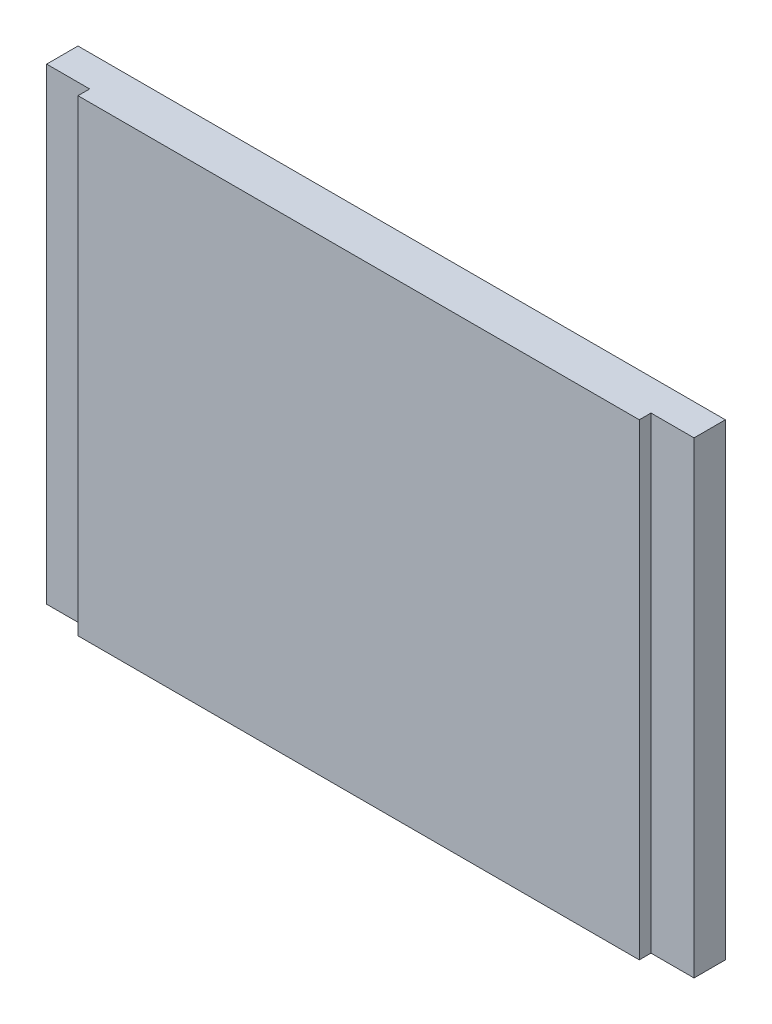
ISO-10303-21;
HEADER;
FILE_DESCRIPTION(('STEP AP214'),'2;1');
FILE_NAME('part.step','',(''),(''),'','','');
FILE_SCHEMA(('AUTOMOTIVE_DESIGN { 1 0 10303 214 1 1 1 1 }'));
ENDSEC;
DATA;
#1=APPLICATION_CONTEXT('core data for automotive mechanical design processes');
#2=APPLICATION_PROTOCOL_DEFINITION('international standard','automotive_design',2000,#1);
#3=PRODUCT_CONTEXT('',#1,'mechanical');
#4=PRODUCT('Part','Part','',(#3));
#5=PRODUCT_RELATED_PRODUCT_CATEGORY('part','',(#4));
#6=PRODUCT_DEFINITION_FORMATION('','',#4);
#7=PRODUCT_DEFINITION_CONTEXT('part definition',#1,'design');
#8=PRODUCT_DEFINITION('design','',#6,#7);
#9=PRODUCT_DEFINITION_SHAPE('','',#8);
#10=(LENGTH_UNIT() NAMED_UNIT(*) SI_UNIT(.MILLI.,.METRE.));
#11=(NAMED_UNIT(*) PLANE_ANGLE_UNIT() SI_UNIT($,.RADIAN.));
#12=(NAMED_UNIT(*) SI_UNIT($,.STERADIAN.) SOLID_ANGLE_UNIT());
#13=UNCERTAINTY_MEASURE_WITH_UNIT(LENGTH_MEASURE(1.E-05),#10,'distance_accuracy_value','');
#14=(GEOMETRIC_REPRESENTATION_CONTEXT(3) GLOBAL_UNCERTAINTY_ASSIGNED_CONTEXT((#13)) GLOBAL_UNIT_ASSIGNED_CONTEXT((#10,
#11,#12)) REPRESENTATION_CONTEXT('',''));
#15=CARTESIAN_POINT('',(0.,0.,0.));
#16=DIRECTION('',(0.,0.,1.));
#17=DIRECTION('',(1.,0.,0.));
#18=AXIS2_PLACEMENT_3D('',#15,#16,#17);
#19=CARTESIAN_POINT('',(0.,0.,5.842));
#20=DIRECTION('',(1.,0.,0.));
#21=DIRECTION('',(0.,0.,-1.));
#22=AXIS2_PLACEMENT_3D('',#19,#20,#21);
#23=PLANE('',#22);
#24=DIRECTION('',(0.,0.,-1.));
#25=VECTOR('',#24,1.);
#26=CARTESIAN_POINT('',(0.,0.,5.842));
#27=LINE('',#26,#25);
#28=CARTESIAN_POINT('',(0.,0.,4.2545));
#29=VERTEX_POINT('',#28);
#30=CARTESIAN_POINT('',(0.,0.,0.));
#31=VERTEX_POINT('',#30);
#32=EDGE_CURVE('E11',#29,#31,#27,.T.);
#33=ORIENTED_EDGE('',*,*,#32,.F.);
#34=DIRECTION('',(0.,-1.,0.));
#35=VECTOR('',#34,1.);
#36=CARTESIAN_POINT('',(0.,0.,4.2545));
#37=LINE('',#36,#35);
#38=CARTESIAN_POINT('',(0.,63.5,4.2545));
#39=VERTEX_POINT('',#38);
#40=EDGE_CURVE('E150',#39,#29,#37,.T.);
#41=ORIENTED_EDGE('',*,*,#40,.F.);
#42=DIRECTION('',(0.,0.,-1.));
#43=VECTOR('',#42,1.);
#44=CARTESIAN_POINT('',(0.,63.5,5.842));
#45=LINE('',#44,#43);
#46=CARTESIAN_POINT('',(0.,63.5,0.));
#47=VERTEX_POINT('',#46);
#48=EDGE_CURVE('E125',#39,#47,#45,.T.);
#49=ORIENTED_EDGE('',*,*,#48,.T.);
#50=DIRECTION('',(0.,-1.,0.));
#51=VECTOR('',#50,1.);
#52=CARTESIAN_POINT('',(0.,0.,0.));
#53=LINE('',#52,#51);
#54=EDGE_CURVE('E137',#47,#31,#53,.T.);
#55=ORIENTED_EDGE('',*,*,#54,.T.);
#56=EDGE_LOOP('',(#33,#41,#49,#55));
#57=FACE_BOUND('',#56,.T.);
#58=ADVANCED_FACE('F37',(#57),#23,.F.);
#59=CARTESIAN_POINT('',(0.,0.,5.842));
#60=DIRECTION('',(0.,1.,0.));
#61=DIRECTION('',(0.,0.,1.));
#62=AXIS2_PLACEMENT_3D('',#59,#60,#61);
#63=PLANE('',#62);
#64=DIRECTION('',(1.,0.,0.));
#65=VECTOR('',#64,1.);
#66=CARTESIAN_POINT('',(87.884,0.,4.2545));
#67=LINE('',#66,#65);
#68=CARTESIAN_POINT('',(82.042,0.,4.2545));
#69=VERTEX_POINT('',#68);
#70=CARTESIAN_POINT('',(87.884,0.,4.2545));
#71=VERTEX_POINT('',#70);
#72=EDGE_CURVE('E107',#69,#71,#67,.T.);
#73=ORIENTED_EDGE('',*,*,#72,.F.);
#74=DIRECTION('',(0.,0.,1.));
#75=VECTOR('',#74,1.);
#76=CARTESIAN_POINT('',(82.042,0.,4.2545));
#77=LINE('',#76,#75);
#78=CARTESIAN_POINT('',(82.042,0.,5.842));
#79=VERTEX_POINT('',#78);
#80=EDGE_CURVE('E151',#69,#79,#77,.T.);
#81=ORIENTED_EDGE('',*,*,#80,.T.);
#82=DIRECTION('',(1.,0.,0.));
#83=VECTOR('',#82,1.);
#84=CARTESIAN_POINT('',(0.,0.,5.842));
#85=LINE('',#84,#83);
#86=CARTESIAN_POINT('',(5.84199999999999,0.,5.842));
#87=VERTEX_POINT('',#86);
#88=EDGE_CURVE('E132',#87,#79,#85,.T.);
#89=ORIENTED_EDGE('',*,*,#88,.F.);
#90=DIRECTION('',(0.,0.,1.));
#91=VECTOR('',#90,1.);
#92=CARTESIAN_POINT('',(5.84199999999999,0.,4.2545));
#93=LINE('',#92,#91);
#94=CARTESIAN_POINT('',(5.84199999999999,0.,4.2545));
#95=VERTEX_POINT('',#94);
#96=EDGE_CURVE('E59',#95,#87,#93,.T.);
#97=ORIENTED_EDGE('',*,*,#96,.F.);
#98=DIRECTION('',(1.,0.,0.));
#99=VECTOR('',#98,1.);
#100=CARTESIAN_POINT('',(0.,0.,4.2545));
#101=LINE('',#100,#99);
#102=EDGE_CURVE('E156',#29,#95,#101,.T.);
#103=ORIENTED_EDGE('',*,*,#102,.F.);
#104=ORIENTED_EDGE('',*,*,#32,.T.);
#105=DIRECTION('',(1.,0.,0.));
#106=VECTOR('',#105,1.);
#107=CARTESIAN_POINT('',(0.,0.,0.));
#108=LINE('',#107,#106);
#109=CARTESIAN_POINT('',(87.884,0.,0.));
#110=VERTEX_POINT('',#109);
#111=EDGE_CURVE('E134',#31,#110,#108,.T.);
#112=ORIENTED_EDGE('',*,*,#111,.T.);
#113=DIRECTION('',(0.,0.,-1.));
#114=VECTOR('',#113,1.);
#115=CARTESIAN_POINT('',(87.884,0.,5.842));
#116=LINE('',#115,#114);
#117=EDGE_CURVE('E44',#71,#110,#116,.T.);
#118=ORIENTED_EDGE('',*,*,#117,.F.);
#119=EDGE_LOOP('',(#73,#81,#89,#97,#103,#104,#112,#118));
#120=FACE_BOUND('',#119,.T.);
#121=ADVANCED_FACE('F166',(#120),#63,.F.);
#122=CARTESIAN_POINT('',(87.884,0.,5.842));
#123=DIRECTION('',(-1.,0.,0.));
#124=DIRECTION('',(0.,0.,1.));
#125=AXIS2_PLACEMENT_3D('',#122,#123,#124);
#126=PLANE('',#125);
#127=DIRECTION('',(0.,0.,-1.));
#128=VECTOR('',#127,1.);
#129=CARTESIAN_POINT('',(87.884,63.5,5.842));
#130=LINE('',#129,#128);
#131=CARTESIAN_POINT('',(87.884,63.5,4.2545));
#132=VERTEX_POINT('',#131);
#133=CARTESIAN_POINT('',(87.884,63.5,0.));
#134=VERTEX_POINT('',#133);
#135=EDGE_CURVE('E117',#132,#134,#130,.T.);
#136=ORIENTED_EDGE('',*,*,#135,.F.);
#137=DIRECTION('',(0.,1.,0.));
#138=VECTOR('',#137,1.);
#139=CARTESIAN_POINT('',(87.884,63.5,4.2545));
#140=LINE('',#139,#138);
#141=EDGE_CURVE('E101',#71,#132,#140,.T.);
#142=ORIENTED_EDGE('',*,*,#141,.F.);
#143=ORIENTED_EDGE('',*,*,#117,.T.);
#144=DIRECTION('',(0.,1.,0.));
#145=VECTOR('',#144,1.);
#146=CARTESIAN_POINT('',(87.884,0.,0.));
#147=LINE('',#146,#145);
#148=EDGE_CURVE('E123',#110,#134,#147,.T.);
#149=ORIENTED_EDGE('',*,*,#148,.T.);
#150=EDGE_LOOP('',(#136,#142,#143,#149));
#151=FACE_BOUND('',#150,.T.);
#152=ADVANCED_FACE('F121',(#151),#126,.F.);
#153=CARTESIAN_POINT('',(0.,63.5,5.842));
#154=DIRECTION('',(0.,-1.,0.));
#155=DIRECTION('',(0.,0.,-1.));
#156=AXIS2_PLACEMENT_3D('',#153,#154,#155);
#157=PLANE('',#156);
#158=DIRECTION('',(-1.,0.,0.));
#159=VECTOR('',#158,1.);
#160=CARTESIAN_POINT('',(0.,63.5,5.842));
#161=LINE('',#160,#159);
#162=CARTESIAN_POINT('',(82.042,63.5,5.842));
#163=VERTEX_POINT('',#162);
#164=CARTESIAN_POINT('',(5.84199999999999,63.5,5.842));
#165=VERTEX_POINT('',#164);
#166=EDGE_CURVE('E127',#163,#165,#161,.T.);
#167=ORIENTED_EDGE('',*,*,#166,.F.);
#168=DIRECTION('',(0.,0.,1.));
#169=VECTOR('',#168,1.);
#170=CARTESIAN_POINT('',(82.042,63.5,4.2545));
#171=LINE('',#170,#169);
#172=CARTESIAN_POINT('',(82.042,63.5,4.2545));
#173=VERTEX_POINT('',#172);
#174=EDGE_CURVE('E51',#173,#163,#171,.T.);
#175=ORIENTED_EDGE('',*,*,#174,.F.);
#176=DIRECTION('',(-1.,0.,0.));
#177=VECTOR('',#176,1.);
#178=CARTESIAN_POINT('',(87.884,63.5,4.2545));
#179=LINE('',#178,#177);
#180=EDGE_CURVE('E105',#132,#173,#179,.T.);
#181=ORIENTED_EDGE('',*,*,#180,.F.);
#182=ORIENTED_EDGE('',*,*,#135,.T.);
#183=DIRECTION('',(-1.,0.,0.));
#184=VECTOR('',#183,1.);
#185=CARTESIAN_POINT('',(0.,63.5,0.));
#186=LINE('',#185,#184);
#187=EDGE_CURVE('E130',#134,#47,#186,.T.);
#188=ORIENTED_EDGE('',*,*,#187,.T.);
#189=ORIENTED_EDGE('',*,*,#48,.F.);
#190=DIRECTION('',(-1.,0.,0.));
#191=VECTOR('',#190,1.);
#192=CARTESIAN_POINT('',(0.,63.5,4.2545));
#193=LINE('',#192,#191);
#194=CARTESIAN_POINT('',(5.84199999999999,63.5,4.2545));
#195=VERTEX_POINT('',#194);
#196=EDGE_CURVE('E145',#195,#39,#193,.T.);
#197=ORIENTED_EDGE('',*,*,#196,.F.);
#198=DIRECTION('',(0.,0.,1.));
#199=VECTOR('',#198,1.);
#200=CARTESIAN_POINT('',(5.84199999999999,63.5,4.2545));
#201=LINE('',#200,#199);
#202=EDGE_CURVE('E140',#195,#165,#201,.T.);
#203=ORIENTED_EDGE('',*,*,#202,.T.);
#204=EDGE_LOOP('',(#167,#175,#181,#182,#188,#189,#197,#203));
#205=FACE_BOUND('',#204,.T.);
#206=ADVANCED_FACE('F115',(#205),#157,.F.);
#207=CARTESIAN_POINT('',(0.,0.,5.842));
#208=DIRECTION('',(0.,0.,-1.));
#209=DIRECTION('',(-1.,0.,0.));
#210=AXIS2_PLACEMENT_3D('',#207,#208,#209);
#211=PLANE('',#210);
#212=ORIENTED_EDGE('',*,*,#88,.T.);
#213=DIRECTION('',(0.,-1.,0.));
#214=VECTOR('',#213,1.);
#215=CARTESIAN_POINT('',(82.042,63.5,5.842));
#216=LINE('',#215,#214);
#217=EDGE_CURVE('E111',#163,#79,#216,.T.);
#218=ORIENTED_EDGE('',*,*,#217,.F.);
#219=ORIENTED_EDGE('',*,*,#166,.T.);
#220=DIRECTION('',(0.,1.,0.));
#221=VECTOR('',#220,1.);
#222=CARTESIAN_POINT('',(5.84199999999999,0.,5.842));
#223=LINE('',#222,#221);
#224=EDGE_CURVE('E148',#87,#165,#223,.T.);
#225=ORIENTED_EDGE('',*,*,#224,.F.);
#226=EDGE_LOOP('',(#212,#218,#219,#225));
#227=FACE_BOUND('',#226,.T.);
#228=ADVANCED_FACE('F181',(#227),#211,.F.);
#229=CARTESIAN_POINT('',(0.,0.,0.));
#230=DIRECTION('',(0.,0.,-1.));
#231=DIRECTION('',(-1.,0.,0.));
#232=AXIS2_PLACEMENT_3D('',#229,#230,#231);
#233=PLANE('',#232);
#234=ORIENTED_EDGE('',*,*,#54,.F.);
#235=ORIENTED_EDGE('',*,*,#187,.F.);
#236=ORIENTED_EDGE('',*,*,#148,.F.);
#237=ORIENTED_EDGE('',*,*,#111,.F.);
#238=EDGE_LOOP('',(#234,#235,#236,#237));
#239=FACE_BOUND('',#238,.T.);
#240=ADVANCED_FACE('F173',(#239),#233,.T.);
#241=CARTESIAN_POINT('',(5.84199999999999,0.,4.2545));
#242=DIRECTION('',(1.,0.,0.));
#243=DIRECTION('',(0.,0.,-1.));
#244=AXIS2_PLACEMENT_3D('',#241,#242,#243);
#245=PLANE('',#244);
#246=ORIENTED_EDGE('',*,*,#224,.T.);
#247=ORIENTED_EDGE('',*,*,#202,.F.);
#248=DIRECTION('',(0.,1.,0.));
#249=VECTOR('',#248,1.);
#250=CARTESIAN_POINT('',(5.84199999999999,0.,4.2545));
#251=LINE('',#250,#249);
#252=EDGE_CURVE('E153',#95,#195,#251,.T.);
#253=ORIENTED_EDGE('',*,*,#252,.F.);
#254=ORIENTED_EDGE('',*,*,#96,.T.);
#255=EDGE_LOOP('',(#246,#247,#253,#254));
#256=FACE_BOUND('',#255,.T.);
#257=ADVANCED_FACE('F182',(#256),#245,.F.);
#258=CARTESIAN_POINT('',(0.,0.,4.2545));
#259=DIRECTION('',(0.,0.,-1.));
#260=DIRECTION('',(-1.,0.,0.));
#261=AXIS2_PLACEMENT_3D('',#258,#259,#260);
#262=PLANE('',#261);
#263=ORIENTED_EDGE('',*,*,#40,.T.);
#264=ORIENTED_EDGE('',*,*,#102,.T.);
#265=ORIENTED_EDGE('',*,*,#252,.T.);
#266=ORIENTED_EDGE('',*,*,#196,.T.);
#267=EDGE_LOOP('',(#263,#264,#265,#266));
#268=FACE_BOUND('',#267,.T.);
#269=ADVANCED_FACE('F179',(#268),#262,.F.);
#270=CARTESIAN_POINT('',(82.042,63.5,4.2545));
#271=DIRECTION('',(-1.,0.,0.));
#272=DIRECTION('',(0.,0.,1.));
#273=AXIS2_PLACEMENT_3D('',#270,#271,#272);
#274=PLANE('',#273);
#275=ORIENTED_EDGE('',*,*,#217,.T.);
#276=ORIENTED_EDGE('',*,*,#80,.F.);
#277=DIRECTION('',(0.,-1.,0.));
#278=VECTOR('',#277,1.);
#279=CARTESIAN_POINT('',(82.042,63.5,4.2545));
#280=LINE('',#279,#278);
#281=EDGE_CURVE('E119',#173,#69,#280,.T.);
#282=ORIENTED_EDGE('',*,*,#281,.F.);
#283=ORIENTED_EDGE('',*,*,#174,.T.);
#284=EDGE_LOOP('',(#275,#276,#282,#283));
#285=FACE_BOUND('',#284,.T.);
#286=ADVANCED_FACE('F189',(#285),#274,.F.);
#287=CARTESIAN_POINT('',(0.,0.,4.2545));
#288=DIRECTION('',(0.,0.,-1.));
#289=DIRECTION('',(-1.,0.,0.));
#290=AXIS2_PLACEMENT_3D('',#287,#288,#289);
#291=PLANE('',#290);
#292=ORIENTED_EDGE('',*,*,#141,.T.);
#293=ORIENTED_EDGE('',*,*,#180,.T.);
#294=ORIENTED_EDGE('',*,*,#281,.T.);
#295=ORIENTED_EDGE('',*,*,#72,.T.);
#296=EDGE_LOOP('',(#292,#293,#294,#295));
#297=FACE_BOUND('',#296,.T.);
#298=ADVANCED_FACE('F103',(#297),#291,.F.);
#299=CLOSED_SHELL('',(#58,#121,#152,#206,#228,#240,#257,#269,#286,#298));
#300=MANIFOLD_SOLID_BREP('B2',#299);
#301=ADVANCED_BREP_SHAPE_REPRESENTATION('',(#18,#300),#14);
#302=SHAPE_DEFINITION_REPRESENTATION(#9,#301);
ENDSEC;
END-ISO-10303-21;
